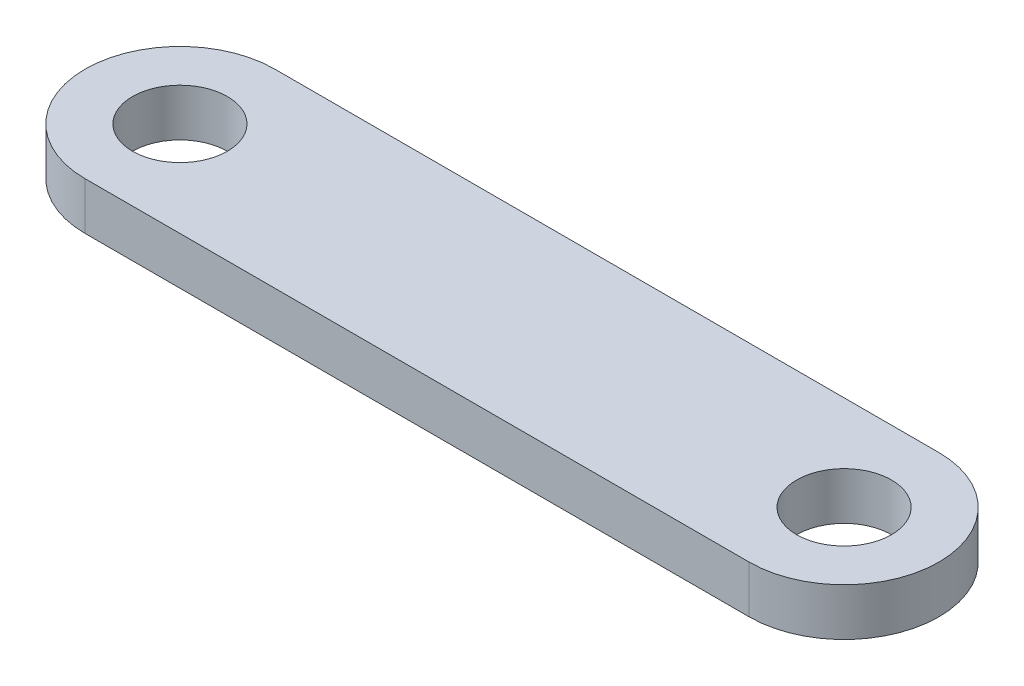
ISO-10303-21;
HEADER;
FILE_DESCRIPTION(('STEP AP214'),'2;1');
FILE_NAME('part.step','',(''),(''),'','','');
FILE_SCHEMA(('AUTOMOTIVE_DESIGN { 1 0 10303 214 1 1 1 1 }'));
ENDSEC;
DATA;
#1=APPLICATION_CONTEXT('core data for automotive mechanical design processes');
#2=APPLICATION_PROTOCOL_DEFINITION('international standard','automotive_design',2000,#1);
#3=PRODUCT_CONTEXT('',#1,'mechanical');
#4=PRODUCT('Part','Part','',(#3));
#5=PRODUCT_RELATED_PRODUCT_CATEGORY('part','',(#4));
#6=PRODUCT_DEFINITION_FORMATION('','',#4);
#7=PRODUCT_DEFINITION_CONTEXT('part definition',#1,'design');
#8=PRODUCT_DEFINITION('design','',#6,#7);
#9=PRODUCT_DEFINITION_SHAPE('','',#8);
#10=(LENGTH_UNIT() NAMED_UNIT(*) SI_UNIT(.MILLI.,.METRE.));
#11=(NAMED_UNIT(*) PLANE_ANGLE_UNIT() SI_UNIT($,.RADIAN.));
#12=(NAMED_UNIT(*) SI_UNIT($,.STERADIAN.) SOLID_ANGLE_UNIT());
#13=UNCERTAINTY_MEASURE_WITH_UNIT(LENGTH_MEASURE(1.E-05),#10,'distance_accuracy_value','');
#14=(GEOMETRIC_REPRESENTATION_CONTEXT(3) GLOBAL_UNCERTAINTY_ASSIGNED_CONTEXT((#13)) GLOBAL_UNIT_ASSIGNED_CONTEXT((#10,
#11,#12)) REPRESENTATION_CONTEXT('',''));
#15=CARTESIAN_POINT('',(0.,0.,0.));
#16=DIRECTION('',(0.,0.,1.));
#17=DIRECTION('',(1.,0.,0.));
#18=AXIS2_PLACEMENT_3D('',#15,#16,#17);
#19=CARTESIAN_POINT('',(-35.,5.,0.));
#20=DIRECTION('',(0.,1.,0.));
#21=DIRECTION('',(0.,0.,1.));
#22=AXIS2_PLACEMENT_3D('',#19,#20,#21);
#23=PLANE('',#22);
#24=CARTESIAN_POINT('',(-35.,5.,0.));
#25=DIRECTION('',(0.,1.,0.));
#26=DIRECTION('',(0.,0.,1.));
#27=AXIS2_PLACEMENT_3D('',#24,#25,#26);
#28=CIRCLE('',#27,5.00000000000002);
#29=CARTESIAN_POINT('',(-35.,5.,5.00000000000002));
#30=VERTEX_POINT('',#29);
#31=EDGE_CURVE('E108',#30,#30,#28,.T.);
#32=ORIENTED_EDGE('',*,*,#31,.F.);
#33=EDGE_LOOP('',(#32));
#34=FACE_BOUND('',#33,.T.);
#35=CARTESIAN_POINT('',(-35.,5.,0.));
#36=DIRECTION('',(0.,1.,0.));
#37=DIRECTION('',(0.,0.,1.));
#38=AXIS2_PLACEMENT_3D('',#35,#36,#37);
#39=CIRCLE('',#38,10.);
#40=CARTESIAN_POINT('',(-35.,5.,-10.));
#41=VERTEX_POINT('',#40);
#42=CARTESIAN_POINT('',(-35.,5.,10.));
#43=VERTEX_POINT('',#42);
#44=EDGE_CURVE('E93',#41,#43,#39,.T.);
#45=ORIENTED_EDGE('',*,*,#44,.T.);
#46=DIRECTION('',(1.,0.,0.));
#47=VECTOR('',#46,1.);
#48=CARTESIAN_POINT('',(-35.,5.,10.));
#49=LINE('',#48,#47);
#50=CARTESIAN_POINT('',(35.,5.,10.));
#51=VERTEX_POINT('',#50);
#52=EDGE_CURVE('E88',#43,#51,#49,.T.);
#53=ORIENTED_EDGE('',*,*,#52,.T.);
#54=CARTESIAN_POINT('',(35.,5.,0.));
#55=DIRECTION('',(0.,1.,0.));
#56=DIRECTION('',(0.,0.,1.));
#57=AXIS2_PLACEMENT_3D('',#54,#55,#56);
#58=CIRCLE('',#57,10.);
#59=CARTESIAN_POINT('',(35.,5.,-10.));
#60=VERTEX_POINT('',#59);
#61=EDGE_CURVE('E91',#51,#60,#58,.T.);
#62=ORIENTED_EDGE('',*,*,#61,.T.);
#63=DIRECTION('',(-1.,0.,0.));
#64=VECTOR('',#63,1.);
#65=CARTESIAN_POINT('',(-35.,5.,-10.));
#66=LINE('',#65,#64);
#67=EDGE_CURVE('E58',#60,#41,#66,.T.);
#68=ORIENTED_EDGE('',*,*,#67,.T.);
#69=EDGE_LOOP('',(#45,#53,#62,#68));
#70=FACE_BOUND('',#69,.T.);
#71=CARTESIAN_POINT('',(35.,5.,0.));
#72=DIRECTION('',(0.,1.,0.));
#73=DIRECTION('',(0.,0.,1.));
#74=AXIS2_PLACEMENT_3D('',#71,#72,#73);
#75=CIRCLE('',#74,5.00000000000003);
#76=CARTESIAN_POINT('',(35.,5.,5.00000000000003));
#77=VERTEX_POINT('',#76);
#78=EDGE_CURVE('E123',#77,#77,#75,.T.);
#79=ORIENTED_EDGE('',*,*,#78,.F.);
#80=EDGE_LOOP('',(#79));
#81=FACE_BOUND('',#80,.T.);
#82=ADVANCED_FACE('F41',(#34,#70,#81),#23,.T.);
#83=CARTESIAN_POINT('',(-35.,0.,0.));
#84=DIRECTION('',(0.,1.,0.));
#85=DIRECTION('',(0.,0.,1.));
#86=AXIS2_PLACEMENT_3D('',#83,#84,#85);
#87=PLANE('',#86);
#88=CARTESIAN_POINT('',(-35.,0.,0.));
#89=DIRECTION('',(0.,1.,0.));
#90=DIRECTION('',(0.,0.,1.));
#91=AXIS2_PLACEMENT_3D('',#88,#89,#90);
#92=CIRCLE('',#91,10.);
#93=CARTESIAN_POINT('',(-35.,0.,-10.));
#94=VERTEX_POINT('',#93);
#95=CARTESIAN_POINT('',(-35.,0.,10.));
#96=VERTEX_POINT('',#95);
#97=EDGE_CURVE('E105',#94,#96,#92,.T.);
#98=ORIENTED_EDGE('',*,*,#97,.F.);
#99=DIRECTION('',(-1.,0.,0.));
#100=VECTOR('',#99,1.);
#101=CARTESIAN_POINT('',(-35.,0.,-10.));
#102=LINE('',#101,#100);
#103=CARTESIAN_POINT('',(35.,0.,-10.));
#104=VERTEX_POINT('',#103);
#105=EDGE_CURVE('E81',#104,#94,#102,.T.);
#106=ORIENTED_EDGE('',*,*,#105,.F.);
#107=CARTESIAN_POINT('',(35.,0.,0.));
#108=DIRECTION('',(0.,1.,0.));
#109=DIRECTION('',(0.,0.,1.));
#110=AXIS2_PLACEMENT_3D('',#107,#108,#109);
#111=CIRCLE('',#110,10.);
#112=CARTESIAN_POINT('',(35.,0.,10.));
#113=VERTEX_POINT('',#112);
#114=EDGE_CURVE('E75',#113,#104,#111,.T.);
#115=ORIENTED_EDGE('',*,*,#114,.F.);
#116=DIRECTION('',(1.,0.,0.));
#117=VECTOR('',#116,1.);
#118=CARTESIAN_POINT('',(-35.,0.,10.));
#119=LINE('',#118,#117);
#120=EDGE_CURVE('E97',#96,#113,#119,.T.);
#121=ORIENTED_EDGE('',*,*,#120,.F.);
#122=EDGE_LOOP('',(#98,#106,#115,#121));
#123=FACE_BOUND('',#122,.T.);
#124=CARTESIAN_POINT('',(-35.,0.,0.));
#125=DIRECTION('',(0.,1.,0.));
#126=DIRECTION('',(0.,0.,1.));
#127=AXIS2_PLACEMENT_3D('',#124,#125,#126);
#128=CIRCLE('',#127,5.00000000000002);
#129=CARTESIAN_POINT('',(-35.,0.,5.00000000000002));
#130=VERTEX_POINT('',#129);
#131=EDGE_CURVE('E120',#130,#130,#128,.T.);
#132=ORIENTED_EDGE('',*,*,#131,.T.);
#133=EDGE_LOOP('',(#132));
#134=FACE_BOUND('',#133,.T.);
#135=CARTESIAN_POINT('',(35.,0.,0.));
#136=DIRECTION('',(0.,1.,0.));
#137=DIRECTION('',(0.,0.,1.));
#138=AXIS2_PLACEMENT_3D('',#135,#136,#137);
#139=CIRCLE('',#138,5.00000000000003);
#140=CARTESIAN_POINT('',(35.,0.,5.00000000000003));
#141=VERTEX_POINT('',#140);
#142=EDGE_CURVE('E126',#141,#141,#139,.T.);
#143=ORIENTED_EDGE('',*,*,#142,.T.);
#144=EDGE_LOOP('',(#143));
#145=FACE_BOUND('',#144,.T.);
#146=ADVANCED_FACE('F116',(#123,#134,#145),#87,.F.);
#147=CARTESIAN_POINT('',(-35.,5.,0.));
#148=DIRECTION('',(0.,-1.,0.));
#149=DIRECTION('',(0.,0.,-1.));
#150=AXIS2_PLACEMENT_3D('',#147,#148,#149);
#151=CYLINDRICAL_SURFACE('',#150,10.);
#152=ORIENTED_EDGE('',*,*,#97,.T.);
#153=DIRECTION('',(0.,-1.,0.));
#154=VECTOR('',#153,1.);
#155=CARTESIAN_POINT('',(-35.,5.,10.));
#156=LINE('',#155,#154);
#157=EDGE_CURVE('E11',#43,#96,#156,.T.);
#158=ORIENTED_EDGE('',*,*,#157,.F.);
#159=ORIENTED_EDGE('',*,*,#44,.F.);
#160=DIRECTION('',(0.,-1.,0.));
#161=VECTOR('',#160,1.);
#162=CARTESIAN_POINT('',(-35.,5.,-10.));
#163=LINE('',#162,#161);
#164=EDGE_CURVE('E101',#41,#94,#163,.T.);
#165=ORIENTED_EDGE('',*,*,#164,.T.);
#166=EDGE_LOOP('',(#152,#158,#159,#165));
#167=FACE_BOUND('',#166,.T.);
#168=ADVANCED_FACE('F43',(#167),#151,.T.);
#169=CARTESIAN_POINT('',(-35.,5.,10.));
#170=DIRECTION('',(0.,0.,-1.));
#171=DIRECTION('',(-1.,0.,0.));
#172=AXIS2_PLACEMENT_3D('',#169,#170,#171);
#173=PLANE('',#172);
#174=ORIENTED_EDGE('',*,*,#120,.T.);
#175=DIRECTION('',(0.,-1.,0.));
#176=VECTOR('',#175,1.);
#177=CARTESIAN_POINT('',(35.,5.,10.));
#178=LINE('',#177,#176);
#179=EDGE_CURVE('E50',#51,#113,#178,.T.);
#180=ORIENTED_EDGE('',*,*,#179,.F.);
#181=ORIENTED_EDGE('',*,*,#52,.F.);
#182=ORIENTED_EDGE('',*,*,#157,.T.);
#183=EDGE_LOOP('',(#174,#180,#181,#182));
#184=FACE_BOUND('',#183,.T.);
#185=ADVANCED_FACE('F96',(#184),#173,.F.);
#186=CARTESIAN_POINT('',(35.,5.,0.));
#187=DIRECTION('',(0.,-1.,0.));
#188=DIRECTION('',(0.,0.,-1.));
#189=AXIS2_PLACEMENT_3D('',#186,#187,#188);
#190=CYLINDRICAL_SURFACE('',#189,10.);
#191=ORIENTED_EDGE('',*,*,#114,.T.);
#192=DIRECTION('',(0.,-1.,0.));
#193=VECTOR('',#192,1.);
#194=CARTESIAN_POINT('',(35.,5.,-10.));
#195=LINE('',#194,#193);
#196=EDGE_CURVE('E98',#60,#104,#195,.T.);
#197=ORIENTED_EDGE('',*,*,#196,.F.);
#198=ORIENTED_EDGE('',*,*,#61,.F.);
#199=ORIENTED_EDGE('',*,*,#179,.T.);
#200=EDGE_LOOP('',(#191,#197,#198,#199));
#201=FACE_BOUND('',#200,.T.);
#202=ADVANCED_FACE('F99',(#201),#190,.T.);
#203=CARTESIAN_POINT('',(-35.,5.,-10.));
#204=DIRECTION('',(0.,0.,1.));
#205=DIRECTION('',(1.,0.,0.));
#206=AXIS2_PLACEMENT_3D('',#203,#204,#205);
#207=PLANE('',#206);
#208=ORIENTED_EDGE('',*,*,#105,.T.);
#209=ORIENTED_EDGE('',*,*,#164,.F.);
#210=ORIENTED_EDGE('',*,*,#67,.F.);
#211=ORIENTED_EDGE('',*,*,#196,.T.);
#212=EDGE_LOOP('',(#208,#209,#210,#211));
#213=FACE_BOUND('',#212,.T.);
#214=ADVANCED_FACE('F113',(#213),#207,.F.);
#215=CARTESIAN_POINT('',(-35.,5.,0.));
#216=DIRECTION('',(0.,-1.,0.));
#217=DIRECTION('',(0.,0.,-1.));
#218=AXIS2_PLACEMENT_3D('',#215,#216,#217);
#219=CYLINDRICAL_SURFACE('',#218,5.00000000000002);
#220=ORIENTED_EDGE('',*,*,#31,.T.);
#221=EDGE_LOOP('',(#220));
#222=FACE_BOUND('',#221,.T.);
#223=ORIENTED_EDGE('',*,*,#131,.F.);
#224=EDGE_LOOP('',(#223));
#225=FACE_BOUND('',#224,.T.);
#226=ADVANCED_FACE('F142',(#222,#225),#219,.F.);
#227=CARTESIAN_POINT('',(35.,5.,0.));
#228=DIRECTION('',(0.,-1.,0.));
#229=DIRECTION('',(0.,0.,-1.));
#230=AXIS2_PLACEMENT_3D('',#227,#228,#229);
#231=CYLINDRICAL_SURFACE('',#230,5.00000000000003);
#232=ORIENTED_EDGE('',*,*,#78,.T.);
#233=EDGE_LOOP('',(#232));
#234=FACE_BOUND('',#233,.T.);
#235=ORIENTED_EDGE('',*,*,#142,.F.);
#236=EDGE_LOOP('',(#235));
#237=FACE_BOUND('',#236,.T.);
#238=ADVANCED_FACE('F132',(#234,#237),#231,.F.);
#239=CLOSED_SHELL('',(#82,#146,#168,#185,#202,#214,#226,#238));
#240=MANIFOLD_SOLID_BREP('B2',#239);
#241=ADVANCED_BREP_SHAPE_REPRESENTATION('',(#18,#240),#14);
#242=SHAPE_DEFINITION_REPRESENTATION(#9,#241);
ENDSEC;
END-ISO-10303-21;
